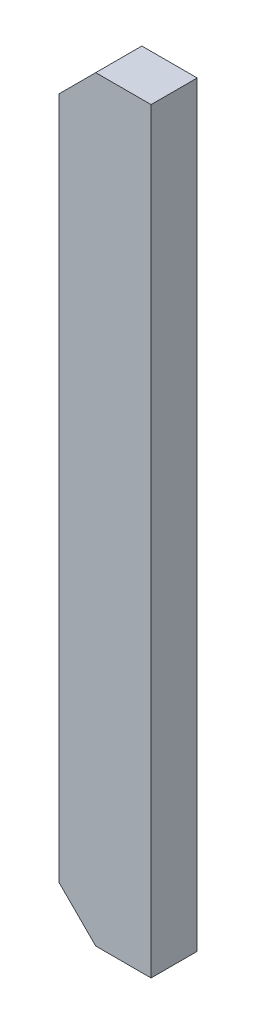
ISO-10303-21;
HEADER;
FILE_DESCRIPTION(('STEP AP214'),'2;1');
FILE_NAME('part.step','',(''),(''),'','','');
FILE_SCHEMA(('AUTOMOTIVE_DESIGN { 1 0 10303 214 1 1 1 1 }'));
ENDSEC;
DATA;
#1=APPLICATION_CONTEXT('core data for automotive mechanical design processes');
#2=APPLICATION_PROTOCOL_DEFINITION('international standard','automotive_design',2000,#1);
#3=PRODUCT_CONTEXT('',#1,'mechanical');
#4=PRODUCT('Part','Part','',(#3));
#5=PRODUCT_RELATED_PRODUCT_CATEGORY('part','',(#4));
#6=PRODUCT_DEFINITION_FORMATION('','',#4);
#7=PRODUCT_DEFINITION_CONTEXT('part definition',#1,'design');
#8=PRODUCT_DEFINITION('design','',#6,#7);
#9=PRODUCT_DEFINITION_SHAPE('','',#8);
#10=(LENGTH_UNIT() NAMED_UNIT(*) SI_UNIT(.MILLI.,.METRE.));
#11=(NAMED_UNIT(*) PLANE_ANGLE_UNIT() SI_UNIT($,.RADIAN.));
#12=(NAMED_UNIT(*) SI_UNIT($,.STERADIAN.) SOLID_ANGLE_UNIT());
#13=UNCERTAINTY_MEASURE_WITH_UNIT(LENGTH_MEASURE(1.E-05),#10,'distance_accuracy_value','');
#14=(GEOMETRIC_REPRESENTATION_CONTEXT(3) GLOBAL_UNCERTAINTY_ASSIGNED_CONTEXT((#13)) GLOBAL_UNIT_ASSIGNED_CONTEXT((#10,
#11,#12)) REPRESENTATION_CONTEXT('',''));
#15=CARTESIAN_POINT('',(0.,0.,0.));
#16=DIRECTION('',(0.,0.,1.));
#17=DIRECTION('',(1.,0.,0.));
#18=AXIS2_PLACEMENT_3D('',#15,#16,#17);
#19=CARTESIAN_POINT('',(0.,-164.,10.));
#20=DIRECTION('',(-1.,0.,0.));
#21=DIRECTION('',(0.,0.,1.));
#22=AXIS2_PLACEMENT_3D('',#19,#20,#21);
#23=PLANE('',#22);
#24=DIRECTION('',(0.,1.,0.));
#25=VECTOR('',#24,1.);
#26=CARTESIAN_POINT('',(0.,-164.,0.));
#27=LINE('',#26,#25);
#28=CARTESIAN_POINT('',(0.,-164.,0.));
#29=VERTEX_POINT('',#28);
#30=CARTESIAN_POINT('',(0.,0.,0.));
#31=VERTEX_POINT('',#30);
#32=EDGE_CURVE('E119',#29,#31,#27,.T.);
#33=ORIENTED_EDGE('',*,*,#32,.T.);
#34=DIRECTION('',(0.,0.,-1.));
#35=VECTOR('',#34,1.);
#36=CARTESIAN_POINT('',(0.,0.,10.));
#37=LINE('',#36,#35);
#38=CARTESIAN_POINT('',(0.,0.,10.));
#39=VERTEX_POINT('',#38);
#40=EDGE_CURVE('E11',#39,#31,#37,.T.);
#41=ORIENTED_EDGE('',*,*,#40,.F.);
#42=DIRECTION('',(0.,1.,0.));
#43=VECTOR('',#42,1.);
#44=CARTESIAN_POINT('',(0.,-164.,10.));
#45=LINE('',#44,#43);
#46=CARTESIAN_POINT('',(0.,-164.,10.));
#47=VERTEX_POINT('',#46);
#48=EDGE_CURVE('E129',#47,#39,#45,.T.);
#49=ORIENTED_EDGE('',*,*,#48,.F.);
#50=DIRECTION('',(0.,0.,-1.));
#51=VECTOR('',#50,1.);
#52=CARTESIAN_POINT('',(0.,-164.,10.));
#53=LINE('',#52,#51);
#54=EDGE_CURVE('E115',#47,#29,#53,.T.);
#55=ORIENTED_EDGE('',*,*,#54,.T.);
#56=EDGE_LOOP('',(#33,#41,#49,#55));
#57=FACE_BOUND('',#56,.T.);
#58=ADVANCED_FACE('F35',(#57),#23,.F.);
#59=CARTESIAN_POINT('',(0.,0.,10.));
#60=DIRECTION('',(0.,-1.,0.));
#61=DIRECTION('',(1.,0.,0.));
#62=AXIS2_PLACEMENT_3D('',#59,#60,#61);
#63=PLANE('',#62);
#64=DIRECTION('',(-1.,0.,0.));
#65=VECTOR('',#64,1.);
#66=CARTESIAN_POINT('',(0.,0.,0.));
#67=LINE('',#66,#65);
#68=CARTESIAN_POINT('',(-12.,0.,0.));
#69=VERTEX_POINT('',#68);
#70=EDGE_CURVE('E122',#31,#69,#67,.T.);
#71=ORIENTED_EDGE('',*,*,#70,.T.);
#72=DIRECTION('',(0.,0.,-1.));
#73=VECTOR('',#72,1.);
#74=CARTESIAN_POINT('',(-12.,0.,10.));
#75=LINE('',#74,#73);
#76=CARTESIAN_POINT('',(-12.,0.,10.));
#77=VERTEX_POINT('',#76);
#78=EDGE_CURVE('E43',#77,#69,#75,.T.);
#79=ORIENTED_EDGE('',*,*,#78,.F.);
#80=DIRECTION('',(-1.,0.,0.));
#81=VECTOR('',#80,1.);
#82=CARTESIAN_POINT('',(0.,0.,10.));
#83=LINE('',#82,#81);
#84=EDGE_CURVE('E88',#39,#77,#83,.T.);
#85=ORIENTED_EDGE('',*,*,#84,.F.);
#86=ORIENTED_EDGE('',*,*,#40,.T.);
#87=EDGE_LOOP('',(#71,#79,#85,#86));
#88=FACE_BOUND('',#87,.T.);
#89=ADVANCED_FACE('F153',(#88),#63,.F.);
#90=CARTESIAN_POINT('',(-12.,0.,10.));
#91=DIRECTION('',(0.707106781186546,-0.707106781186549,0.));
#92=DIRECTION('',(0.707106781186549,0.707106781186546,0.));
#93=AXIS2_PLACEMENT_3D('',#90,#91,#92);
#94=PLANE('',#93);
#95=DIRECTION('',(-0.707106781186549,-0.707106781186546,0.));
#96=VECTOR('',#95,1.);
#97=CARTESIAN_POINT('',(-12.,0.,0.));
#98=LINE('',#97,#96);
#99=CARTESIAN_POINT('',(-20.,-7.99999999999998,0.));
#100=VERTEX_POINT('',#99);
#101=EDGE_CURVE('E124',#69,#100,#98,.T.);
#102=ORIENTED_EDGE('',*,*,#101,.T.);
#103=DIRECTION('',(0.,0.,-1.));
#104=VECTOR('',#103,1.);
#105=CARTESIAN_POINT('',(-20.,-7.99999999999998,10.));
#106=LINE('',#105,#104);
#107=CARTESIAN_POINT('',(-20.,-7.99999999999998,10.));
#108=VERTEX_POINT('',#107);
#109=EDGE_CURVE('E110',#108,#100,#106,.T.);
#110=ORIENTED_EDGE('',*,*,#109,.F.);
#111=DIRECTION('',(-0.707106781186549,-0.707106781186546,0.));
#112=VECTOR('',#111,1.);
#113=CARTESIAN_POINT('',(-12.,0.,10.));
#114=LINE('',#113,#112);
#115=EDGE_CURVE('E101',#77,#108,#114,.T.);
#116=ORIENTED_EDGE('',*,*,#115,.F.);
#117=ORIENTED_EDGE('',*,*,#78,.T.);
#118=EDGE_LOOP('',(#102,#110,#116,#117));
#119=FACE_BOUND('',#118,.T.);
#120=ADVANCED_FACE('F135',(#119),#94,.F.);
#121=CARTESIAN_POINT('',(-20.,-7.99999999999998,10.));
#122=DIRECTION('',(1.,0.,0.));
#123=DIRECTION('',(0.,1.,0.));
#124=AXIS2_PLACEMENT_3D('',#121,#122,#123);
#125=PLANE('',#124);
#126=DIRECTION('',(0.,-1.,0.));
#127=VECTOR('',#126,1.);
#128=CARTESIAN_POINT('',(-20.,-7.99999999999998,0.));
#129=LINE('',#128,#127);
#130=CARTESIAN_POINT('',(-20.,-156.,0.));
#131=VERTEX_POINT('',#130);
#132=EDGE_CURVE('E109',#100,#131,#129,.T.);
#133=ORIENTED_EDGE('',*,*,#132,.T.);
#134=DIRECTION('',(0.,0.,-1.));
#135=VECTOR('',#134,1.);
#136=CARTESIAN_POINT('',(-20.,-156.,10.));
#137=LINE('',#136,#135);
#138=CARTESIAN_POINT('',(-20.,-156.,10.));
#139=VERTEX_POINT('',#138);
#140=EDGE_CURVE('E106',#139,#131,#137,.T.);
#141=ORIENTED_EDGE('',*,*,#140,.F.);
#142=DIRECTION('',(0.,-1.,0.));
#143=VECTOR('',#142,1.);
#144=CARTESIAN_POINT('',(-20.,-7.99999999999998,10.));
#145=LINE('',#144,#143);
#146=EDGE_CURVE('E95',#108,#139,#145,.T.);
#147=ORIENTED_EDGE('',*,*,#146,.F.);
#148=ORIENTED_EDGE('',*,*,#109,.T.);
#149=EDGE_LOOP('',(#133,#141,#147,#148));
#150=FACE_BOUND('',#149,.T.);
#151=ADVANCED_FACE('F107',(#150),#125,.F.);
#152=CARTESIAN_POINT('',(-20.,-156.,10.));
#153=DIRECTION('',(0.707106781186545,0.70710678118655,0.));
#154=DIRECTION('',(-0.70710678118655,0.707106781186545,0.));
#155=AXIS2_PLACEMENT_3D('',#152,#153,#154);
#156=PLANE('',#155);
#157=DIRECTION('',(0.70710678118655,-0.707106781186545,0.));
#158=VECTOR('',#157,1.);
#159=CARTESIAN_POINT('',(-20.,-156.,0.));
#160=LINE('',#159,#158);
#161=CARTESIAN_POINT('',(-12.,-164.,0.));
#162=VERTEX_POINT('',#161);
#163=EDGE_CURVE('E74',#131,#162,#160,.T.);
#164=ORIENTED_EDGE('',*,*,#163,.T.);
#165=DIRECTION('',(0.,0.,-1.));
#166=VECTOR('',#165,1.);
#167=CARTESIAN_POINT('',(-12.,-164.,10.));
#168=LINE('',#167,#166);
#169=CARTESIAN_POINT('',(-12.,-164.,10.));
#170=VERTEX_POINT('',#169);
#171=EDGE_CURVE('E111',#170,#162,#168,.T.);
#172=ORIENTED_EDGE('',*,*,#171,.F.);
#173=DIRECTION('',(0.70710678118655,-0.707106781186545,0.));
#174=VECTOR('',#173,1.);
#175=CARTESIAN_POINT('',(-20.,-156.,10.));
#176=LINE('',#175,#174);
#177=EDGE_CURVE('E99',#139,#170,#176,.T.);
#178=ORIENTED_EDGE('',*,*,#177,.F.);
#179=ORIENTED_EDGE('',*,*,#140,.T.);
#180=EDGE_LOOP('',(#164,#172,#178,#179));
#181=FACE_BOUND('',#180,.T.);
#182=ADVANCED_FACE('F113',(#181),#156,.F.);
#183=CARTESIAN_POINT('',(-12.,-164.,10.));
#184=DIRECTION('',(0.,1.,0.));
#185=DIRECTION('',(0.,0.,1.));
#186=AXIS2_PLACEMENT_3D('',#183,#184,#185);
#187=PLANE('',#186);
#188=DIRECTION('',(1.,0.,0.));
#189=VECTOR('',#188,1.);
#190=CARTESIAN_POINT('',(-12.,-164.,0.));
#191=LINE('',#190,#189);
#192=EDGE_CURVE('E80',#162,#29,#191,.T.);
#193=ORIENTED_EDGE('',*,*,#192,.T.);
#194=ORIENTED_EDGE('',*,*,#54,.F.);
#195=DIRECTION('',(1.,0.,0.));
#196=VECTOR('',#195,1.);
#197=CARTESIAN_POINT('',(-12.,-164.,10.));
#198=LINE('',#197,#196);
#199=EDGE_CURVE('E51',#170,#47,#198,.T.);
#200=ORIENTED_EDGE('',*,*,#199,.F.);
#201=ORIENTED_EDGE('',*,*,#171,.T.);
#202=EDGE_LOOP('',(#193,#194,#200,#201));
#203=FACE_BOUND('',#202,.T.);
#204=ADVANCED_FACE('F142',(#203),#187,.F.);
#205=CARTESIAN_POINT('',(0.,0.,10.));
#206=DIRECTION('',(0.,0.,1.));
#207=DIRECTION('',(1.,0.,0.));
#208=AXIS2_PLACEMENT_3D('',#205,#206,#207);
#209=PLANE('',#208);
#210=ORIENTED_EDGE('',*,*,#48,.T.);
#211=ORIENTED_EDGE('',*,*,#84,.T.);
#212=ORIENTED_EDGE('',*,*,#115,.T.);
#213=ORIENTED_EDGE('',*,*,#146,.T.);
#214=ORIENTED_EDGE('',*,*,#177,.T.);
#215=ORIENTED_EDGE('',*,*,#199,.T.);
#216=EDGE_LOOP('',(#210,#211,#212,#213,#214,#215));
#217=FACE_BOUND('',#216,.T.);
#218=ADVANCED_FACE('F97',(#217),#209,.T.);
#219=CARTESIAN_POINT('',(0.,0.,0.));
#220=DIRECTION('',(0.,0.,1.));
#221=DIRECTION('',(1.,0.,0.));
#222=AXIS2_PLACEMENT_3D('',#219,#220,#221);
#223=PLANE('',#222);
#224=ORIENTED_EDGE('',*,*,#32,.F.);
#225=ORIENTED_EDGE('',*,*,#192,.F.);
#226=ORIENTED_EDGE('',*,*,#163,.F.);
#227=ORIENTED_EDGE('',*,*,#132,.F.);
#228=ORIENTED_EDGE('',*,*,#101,.F.);
#229=ORIENTED_EDGE('',*,*,#70,.F.);
#230=EDGE_LOOP('',(#224,#225,#226,#227,#228,#229));
#231=FACE_BOUND('',#230,.T.);
#232=ADVANCED_FACE('F138',(#231),#223,.F.);
#233=CLOSED_SHELL('',(#58,#89,#120,#151,#182,#204,#218,#232));
#234=MANIFOLD_SOLID_BREP('B2',#233);
#235=ADVANCED_BREP_SHAPE_REPRESENTATION('',(#18,#234),#14);
#236=SHAPE_DEFINITION_REPRESENTATION(#9,#235);
ENDSEC;
END-ISO-10303-21;
